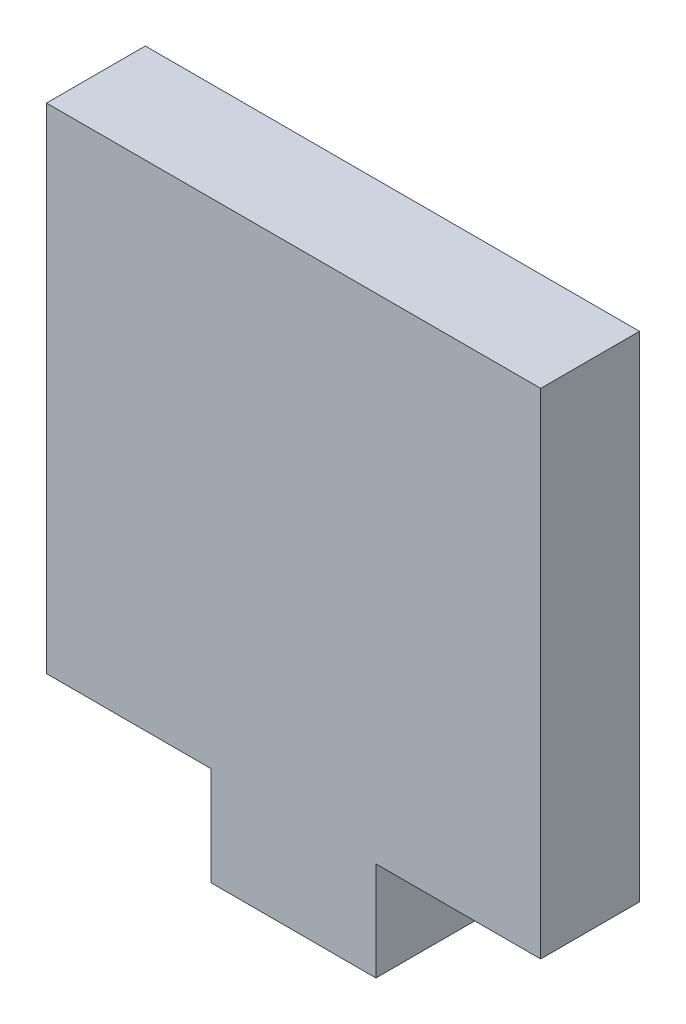
ISO-10303-21;
HEADER;
FILE_DESCRIPTION(('STEP AP214'),'2;1');
FILE_NAME('part.step','',(''),(''),'','','');
FILE_SCHEMA(('AUTOMOTIVE_DESIGN { 1 0 10303 214 1 1 1 1 }'));
ENDSEC;
DATA;
#1=APPLICATION_CONTEXT('core data for automotive mechanical design processes');
#2=APPLICATION_PROTOCOL_DEFINITION('international standard','automotive_design',2000,#1);
#3=PRODUCT_CONTEXT('',#1,'mechanical');
#4=PRODUCT('Part','Part','',(#3));
#5=PRODUCT_RELATED_PRODUCT_CATEGORY('part','',(#4));
#6=PRODUCT_DEFINITION_FORMATION('','',#4);
#7=PRODUCT_DEFINITION_CONTEXT('part definition',#1,'design');
#8=PRODUCT_DEFINITION('design','',#6,#7);
#9=PRODUCT_DEFINITION_SHAPE('','',#8);
#10=(LENGTH_UNIT() NAMED_UNIT(*) SI_UNIT(.MILLI.,.METRE.));
#11=(NAMED_UNIT(*) PLANE_ANGLE_UNIT() SI_UNIT($,.RADIAN.));
#12=(NAMED_UNIT(*) SI_UNIT($,.STERADIAN.) SOLID_ANGLE_UNIT());
#13=UNCERTAINTY_MEASURE_WITH_UNIT(LENGTH_MEASURE(1.E-05),#10,'distance_accuracy_value','');
#14=(GEOMETRIC_REPRESENTATION_CONTEXT(3) GLOBAL_UNCERTAINTY_ASSIGNED_CONTEXT((#13)) GLOBAL_UNIT_ASSIGNED_CONTEXT((#10,
#11,#12)) REPRESENTATION_CONTEXT('',''));
#15=CARTESIAN_POINT('',(0.,0.,0.));
#16=DIRECTION('',(0.,0.,1.));
#17=DIRECTION('',(1.,0.,0.));
#18=AXIS2_PLACEMENT_3D('',#15,#16,#17);
#19=CARTESIAN_POINT('',(0.,0.,3.));
#20=DIRECTION('',(1.,0.,0.));
#21=DIRECTION('',(0.,0.,-1.));
#22=AXIS2_PLACEMENT_3D('',#19,#20,#21);
#23=PLANE('',#22);
#24=DIRECTION('',(0.,-1.,0.));
#25=VECTOR('',#24,1.);
#26=CARTESIAN_POINT('',(0.,0.,0.));
#27=LINE('',#26,#25);
#28=CARTESIAN_POINT('',(0.,15.,0.));
#29=VERTEX_POINT('',#28);
#30=CARTESIAN_POINT('',(0.,0.,0.));
#31=VERTEX_POINT('',#30);
#32=EDGE_CURVE('E140',#29,#31,#27,.T.);
#33=ORIENTED_EDGE('',*,*,#32,.T.);
#34=DIRECTION('',(0.,0.,-1.));
#35=VECTOR('',#34,1.);
#36=CARTESIAN_POINT('',(0.,0.,3.));
#37=LINE('',#36,#35);
#38=CARTESIAN_POINT('',(0.,0.,3.));
#39=VERTEX_POINT('',#38);
#40=EDGE_CURVE('E11',#39,#31,#37,.T.);
#41=ORIENTED_EDGE('',*,*,#40,.F.);
#42=DIRECTION('',(0.,-1.,0.));
#43=VECTOR('',#42,1.);
#44=CARTESIAN_POINT('',(0.,0.,3.));
#45=LINE('',#44,#43);
#46=CARTESIAN_POINT('',(0.,15.,3.));
#47=VERTEX_POINT('',#46);
#48=EDGE_CURVE('E162',#47,#39,#45,.T.);
#49=ORIENTED_EDGE('',*,*,#48,.F.);
#50=DIRECTION('',(0.,0.,-1.));
#51=VECTOR('',#50,1.);
#52=CARTESIAN_POINT('',(0.,15.,3.));
#53=LINE('',#52,#51);
#54=EDGE_CURVE('E136',#47,#29,#53,.T.);
#55=ORIENTED_EDGE('',*,*,#54,.T.);
#56=EDGE_LOOP('',(#33,#41,#49,#55));
#57=FACE_BOUND('',#56,.T.);
#58=ADVANCED_FACE('F39',(#57),#23,.F.);
#59=CARTESIAN_POINT('',(0.,0.,3.));
#60=DIRECTION('',(0.,1.,0.));
#61=DIRECTION('',(-1.,0.,0.));
#62=AXIS2_PLACEMENT_3D('',#59,#60,#61);
#63=PLANE('',#62);
#64=DIRECTION('',(1.,0.,0.));
#65=VECTOR('',#64,1.);
#66=CARTESIAN_POINT('',(0.,0.,0.));
#67=LINE('',#66,#65);
#68=CARTESIAN_POINT('',(5.,0.,0.));
#69=VERTEX_POINT('',#68);
#70=EDGE_CURVE('E144',#31,#69,#67,.T.);
#71=ORIENTED_EDGE('',*,*,#70,.T.);
#72=DIRECTION('',(0.,0.,-1.));
#73=VECTOR('',#72,1.);
#74=CARTESIAN_POINT('',(5.,0.,3.));
#75=LINE('',#74,#73);
#76=CARTESIAN_POINT('',(5.,0.,3.));
#77=VERTEX_POINT('',#76);
#78=EDGE_CURVE('E48',#77,#69,#75,.T.);
#79=ORIENTED_EDGE('',*,*,#78,.F.);
#80=DIRECTION('',(1.,0.,0.));
#81=VECTOR('',#80,1.);
#82=CARTESIAN_POINT('',(0.,0.,3.));
#83=LINE('',#82,#81);
#84=EDGE_CURVE('E99',#39,#77,#83,.T.);
#85=ORIENTED_EDGE('',*,*,#84,.F.);
#86=ORIENTED_EDGE('',*,*,#40,.T.);
#87=EDGE_LOOP('',(#71,#79,#85,#86));
#88=FACE_BOUND('',#87,.T.);
#89=ADVANCED_FACE('F208',(#88),#63,.F.);
#90=CARTESIAN_POINT('',(5.,0.,3.));
#91=DIRECTION('',(1.,0.,0.));
#92=DIRECTION('',(0.,1.,0.));
#93=AXIS2_PLACEMENT_3D('',#90,#91,#92);
#94=PLANE('',#93);
#95=DIRECTION('',(0.,-1.,0.));
#96=VECTOR('',#95,1.);
#97=CARTESIAN_POINT('',(5.,0.,0.));
#98=LINE('',#97,#96);
#99=CARTESIAN_POINT('',(5.,-3.,0.));
#100=VERTEX_POINT('',#99);
#101=EDGE_CURVE('E147',#69,#100,#98,.T.);
#102=ORIENTED_EDGE('',*,*,#101,.T.);
#103=DIRECTION('',(0.,0.,-1.));
#104=VECTOR('',#103,1.);
#105=CARTESIAN_POINT('',(5.,-3.,3.));
#106=LINE('',#105,#104);
#107=CARTESIAN_POINT('',(5.,-3.,3.));
#108=VERTEX_POINT('',#107);
#109=EDGE_CURVE('E173',#108,#100,#106,.T.);
#110=ORIENTED_EDGE('',*,*,#109,.F.);
#111=DIRECTION('',(0.,-1.,0.));
#112=VECTOR('',#111,1.);
#113=CARTESIAN_POINT('',(5.,0.,3.));
#114=LINE('',#113,#112);
#115=EDGE_CURVE('E183',#77,#108,#114,.T.);
#116=ORIENTED_EDGE('',*,*,#115,.F.);
#117=ORIENTED_EDGE('',*,*,#78,.T.);
#118=EDGE_LOOP('',(#102,#110,#116,#117));
#119=FACE_BOUND('',#118,.T.);
#120=ADVANCED_FACE('F181',(#119),#94,.F.);
#121=CARTESIAN_POINT('',(5.,-3.,3.));
#122=DIRECTION('',(0.,1.,0.));
#123=DIRECTION('',(-1.,0.,0.));
#124=AXIS2_PLACEMENT_3D('',#121,#122,#123);
#125=PLANE('',#124);
#126=DIRECTION('',(1.,0.,0.));
#127=VECTOR('',#126,1.);
#128=CARTESIAN_POINT('',(5.,-3.,0.));
#129=LINE('',#128,#127);
#130=CARTESIAN_POINT('',(10.,-3.,0.));
#131=VERTEX_POINT('',#130);
#132=EDGE_CURVE('E150',#100,#131,#129,.T.);
#133=ORIENTED_EDGE('',*,*,#132,.T.);
#134=DIRECTION('',(0.,0.,-1.));
#135=VECTOR('',#134,1.);
#136=CARTESIAN_POINT('',(10.,-3.,3.));
#137=LINE('',#136,#135);
#138=CARTESIAN_POINT('',(10.,-3.,3.));
#139=VERTEX_POINT('',#138);
#140=EDGE_CURVE('E169',#139,#131,#137,.T.);
#141=ORIENTED_EDGE('',*,*,#140,.F.);
#142=DIRECTION('',(1.,0.,0.));
#143=VECTOR('',#142,1.);
#144=CARTESIAN_POINT('',(5.,-3.,3.));
#145=LINE('',#144,#143);
#146=EDGE_CURVE('E196',#108,#139,#145,.T.);
#147=ORIENTED_EDGE('',*,*,#146,.F.);
#148=ORIENTED_EDGE('',*,*,#109,.T.);
#149=EDGE_LOOP('',(#133,#141,#147,#148));
#150=FACE_BOUND('',#149,.T.);
#151=ADVANCED_FACE('F191',(#150),#125,.F.);
#152=CARTESIAN_POINT('',(10.,0.,3.));
#153=DIRECTION('',(-1.,0.,0.));
#154=DIRECTION('',(0.,0.,1.));
#155=AXIS2_PLACEMENT_3D('',#152,#153,#154);
#156=PLANE('',#155);
#157=DIRECTION('',(0.,1.,0.));
#158=VECTOR('',#157,1.);
#159=CARTESIAN_POINT('',(10.,0.,0.));
#160=LINE('',#159,#158);
#161=CARTESIAN_POINT('',(10.,0.,0.));
#162=VERTEX_POINT('',#161);
#163=EDGE_CURVE('E153',#131,#162,#160,.T.);
#164=ORIENTED_EDGE('',*,*,#163,.T.);
#165=DIRECTION('',(0.,0.,-1.));
#166=VECTOR('',#165,1.);
#167=CARTESIAN_POINT('',(10.,0.,3.));
#168=LINE('',#167,#166);
#169=CARTESIAN_POINT('',(10.,0.,3.));
#170=VERTEX_POINT('',#169);
#171=EDGE_CURVE('E129',#170,#162,#168,.T.);
#172=ORIENTED_EDGE('',*,*,#171,.F.);
#173=DIRECTION('',(0.,1.,0.));
#174=VECTOR('',#173,1.);
#175=CARTESIAN_POINT('',(10.,0.,3.));
#176=LINE('',#175,#174);
#177=EDGE_CURVE('E118',#139,#170,#176,.T.);
#178=ORIENTED_EDGE('',*,*,#177,.F.);
#179=ORIENTED_EDGE('',*,*,#140,.T.);
#180=EDGE_LOOP('',(#164,#172,#178,#179));
#181=FACE_BOUND('',#180,.T.);
#182=ADVANCED_FACE('F194',(#181),#156,.F.);
#183=CARTESIAN_POINT('',(10.,0.,3.));
#184=DIRECTION('',(0.,1.,0.));
#185=DIRECTION('',(0.,0.,1.));
#186=AXIS2_PLACEMENT_3D('',#183,#184,#185);
#187=PLANE('',#186);
#188=DIRECTION('',(1.,0.,0.));
#189=VECTOR('',#188,1.);
#190=CARTESIAN_POINT('',(10.,0.,0.));
#191=LINE('',#190,#189);
#192=CARTESIAN_POINT('',(15.,0.,0.));
#193=VERTEX_POINT('',#192);
#194=EDGE_CURVE('E127',#162,#193,#191,.T.);
#195=ORIENTED_EDGE('',*,*,#194,.T.);
#196=DIRECTION('',(0.,0.,-1.));
#197=VECTOR('',#196,1.);
#198=CARTESIAN_POINT('',(15.,0.,3.));
#199=LINE('',#198,#197);
#200=CARTESIAN_POINT('',(15.,0.,3.));
#201=VERTEX_POINT('',#200);
#202=EDGE_CURVE('E124',#201,#193,#199,.T.);
#203=ORIENTED_EDGE('',*,*,#202,.F.);
#204=DIRECTION('',(1.,0.,0.));
#205=VECTOR('',#204,1.);
#206=CARTESIAN_POINT('',(10.,0.,3.));
#207=LINE('',#206,#205);
#208=EDGE_CURVE('E112',#170,#201,#207,.T.);
#209=ORIENTED_EDGE('',*,*,#208,.F.);
#210=ORIENTED_EDGE('',*,*,#171,.T.);
#211=EDGE_LOOP('',(#195,#203,#209,#210));
#212=FACE_BOUND('',#211,.T.);
#213=ADVANCED_FACE('F125',(#212),#187,.F.);
#214=CARTESIAN_POINT('',(15.,0.,3.));
#215=DIRECTION('',(-1.,0.,0.));
#216=DIRECTION('',(0.,0.,1.));
#217=AXIS2_PLACEMENT_3D('',#214,#215,#216);
#218=PLANE('',#217);
#219=DIRECTION('',(0.,1.,0.));
#220=VECTOR('',#219,1.);
#221=CARTESIAN_POINT('',(15.,0.,0.));
#222=LINE('',#221,#220);
#223=CARTESIAN_POINT('',(15.,15.,0.));
#224=VERTEX_POINT('',#223);
#225=EDGE_CURVE('E85',#193,#224,#222,.T.);
#226=ORIENTED_EDGE('',*,*,#225,.T.);
#227=DIRECTION('',(0.,0.,-1.));
#228=VECTOR('',#227,1.);
#229=CARTESIAN_POINT('',(15.,15.,3.));
#230=LINE('',#229,#228);
#231=CARTESIAN_POINT('',(15.,15.,3.));
#232=VERTEX_POINT('',#231);
#233=EDGE_CURVE('E130',#232,#224,#230,.T.);
#234=ORIENTED_EDGE('',*,*,#233,.F.);
#235=DIRECTION('',(0.,1.,0.));
#236=VECTOR('',#235,1.);
#237=CARTESIAN_POINT('',(15.,0.,3.));
#238=LINE('',#237,#236);
#239=EDGE_CURVE('E116',#201,#232,#238,.T.);
#240=ORIENTED_EDGE('',*,*,#239,.F.);
#241=ORIENTED_EDGE('',*,*,#202,.T.);
#242=EDGE_LOOP('',(#226,#234,#240,#241));
#243=FACE_BOUND('',#242,.T.);
#244=ADVANCED_FACE('F132',(#243),#218,.F.);
#245=CARTESIAN_POINT('',(0.,15.,3.));
#246=DIRECTION('',(0.,-1.,0.));
#247=DIRECTION('',(0.,0.,-1.));
#248=AXIS2_PLACEMENT_3D('',#245,#246,#247);
#249=PLANE('',#248);
#250=DIRECTION('',(-1.,0.,0.));
#251=VECTOR('',#250,1.);
#252=CARTESIAN_POINT('',(0.,15.,0.));
#253=LINE('',#252,#251);
#254=EDGE_CURVE('E91',#224,#29,#253,.T.);
#255=ORIENTED_EDGE('',*,*,#254,.T.);
#256=ORIENTED_EDGE('',*,*,#54,.F.);
#257=DIRECTION('',(-1.,0.,0.));
#258=VECTOR('',#257,1.);
#259=CARTESIAN_POINT('',(0.,15.,3.));
#260=LINE('',#259,#258);
#261=EDGE_CURVE('E56',#232,#47,#260,.T.);
#262=ORIENTED_EDGE('',*,*,#261,.F.);
#263=ORIENTED_EDGE('',*,*,#233,.T.);
#264=EDGE_LOOP('',(#255,#256,#262,#263));
#265=FACE_BOUND('',#264,.T.);
#266=ADVANCED_FACE('F224',(#265),#249,.F.);
#267=CARTESIAN_POINT('',(0.,0.,3.));
#268=DIRECTION('',(0.,0.,-1.));
#269=DIRECTION('',(-1.,0.,0.));
#270=AXIS2_PLACEMENT_3D('',#267,#268,#269);
#271=PLANE('',#270);
#272=ORIENTED_EDGE('',*,*,#48,.T.);
#273=ORIENTED_EDGE('',*,*,#84,.T.);
#274=ORIENTED_EDGE('',*,*,#115,.T.);
#275=ORIENTED_EDGE('',*,*,#146,.T.);
#276=ORIENTED_EDGE('',*,*,#177,.T.);
#277=ORIENTED_EDGE('',*,*,#208,.T.);
#278=ORIENTED_EDGE('',*,*,#239,.T.);
#279=ORIENTED_EDGE('',*,*,#261,.T.);
#280=EDGE_LOOP('',(#272,#273,#274,#275,#276,#277,#278,#279));
#281=FACE_BOUND('',#280,.T.);
#282=ADVANCED_FACE('F114',(#281),#271,.F.);
#283=CARTESIAN_POINT('',(0.,0.,0.));
#284=DIRECTION('',(0.,0.,-1.));
#285=DIRECTION('',(-1.,0.,0.));
#286=AXIS2_PLACEMENT_3D('',#283,#284,#285);
#287=PLANE('',#286);
#288=ORIENTED_EDGE('',*,*,#32,.F.);
#289=ORIENTED_EDGE('',*,*,#254,.F.);
#290=ORIENTED_EDGE('',*,*,#225,.F.);
#291=ORIENTED_EDGE('',*,*,#194,.F.);
#292=ORIENTED_EDGE('',*,*,#163,.F.);
#293=ORIENTED_EDGE('',*,*,#132,.F.);
#294=ORIENTED_EDGE('',*,*,#101,.F.);
#295=ORIENTED_EDGE('',*,*,#70,.F.);
#296=EDGE_LOOP('',(#288,#289,#290,#291,#292,#293,#294,#295));
#297=FACE_BOUND('',#296,.T.);
#298=ADVANCED_FACE('F187',(#297),#287,.T.);
#299=CLOSED_SHELL('',(#58,#89,#120,#151,#182,#213,#244,#266,#282,#298));
#300=MANIFOLD_SOLID_BREP('B2',#299);
#301=ADVANCED_BREP_SHAPE_REPRESENTATION('',(#18,#300),#14);
#302=SHAPE_DEFINITION_REPRESENTATION(#9,#301);
ENDSEC;
END-ISO-10303-21;
